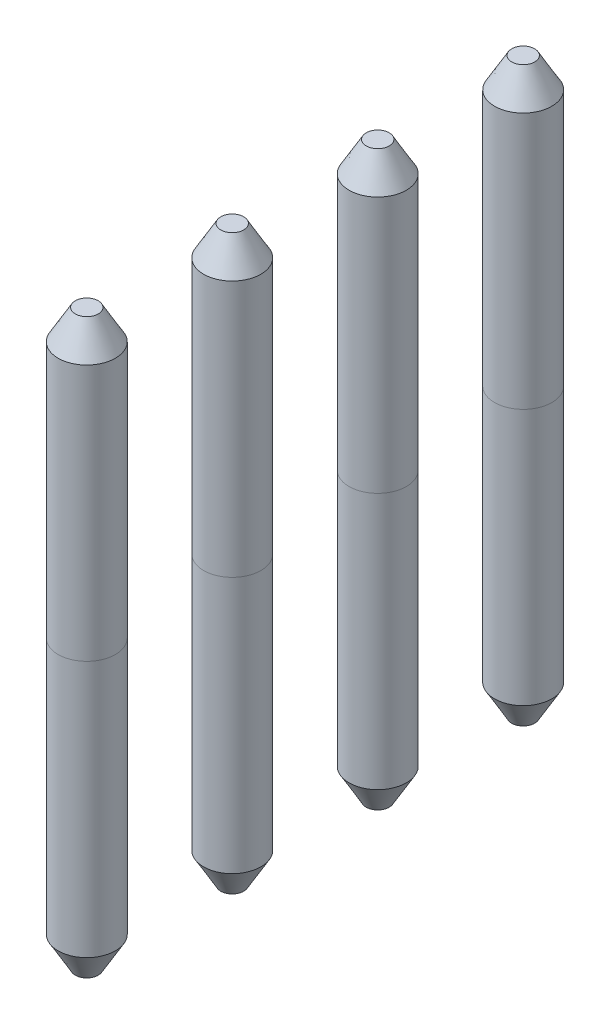
ISO-10303-21;
HEADER;
FILE_DESCRIPTION(('STEP AP214'),'2;1');
FILE_NAME('part.step','',(''),(''),'','','');
FILE_SCHEMA(('AUTOMOTIVE_DESIGN { 1 0 10303 214 1 1 1 1 }'));
ENDSEC;
DATA;
#1=APPLICATION_CONTEXT('core data for automotive mechanical design processes');
#2=APPLICATION_PROTOCOL_DEFINITION('international standard','automotive_design',2000,#1);
#3=PRODUCT_CONTEXT('',#1,'mechanical');
#4=PRODUCT('Part','Part','',(#3));
#5=PRODUCT_RELATED_PRODUCT_CATEGORY('part','',(#4));
#6=PRODUCT_DEFINITION_FORMATION('','',#4);
#7=PRODUCT_DEFINITION_CONTEXT('part definition',#1,'design');
#8=PRODUCT_DEFINITION('design','',#6,#7);
#9=PRODUCT_DEFINITION_SHAPE('','',#8);
#10=(LENGTH_UNIT() NAMED_UNIT(*) SI_UNIT(.MILLI.,.METRE.));
#11=(NAMED_UNIT(*) PLANE_ANGLE_UNIT() SI_UNIT($,.RADIAN.));
#12=(NAMED_UNIT(*) SI_UNIT($,.STERADIAN.) SOLID_ANGLE_UNIT());
#13=UNCERTAINTY_MEASURE_WITH_UNIT(LENGTH_MEASURE(1.E-05),#10,'distance_accuracy_value','');
#14=(GEOMETRIC_REPRESENTATION_CONTEXT(3) GLOBAL_UNCERTAINTY_ASSIGNED_CONTEXT((#13)) GLOBAL_UNIT_ASSIGNED_CONTEXT((#10,
#11,#12)) REPRESENTATION_CONTEXT('',''));
#15=CARTESIAN_POINT('',(0.,0.,0.));
#16=DIRECTION('',(0.,0.,1.));
#17=DIRECTION('',(1.,0.,0.));
#18=AXIS2_PLACEMENT_3D('',#15,#16,#17);
#19=CARTESIAN_POINT('',(0.,0.699186935982855,7.62));
#20=DIRECTION('',(0.,1.,0.));
#21=DIRECTION('',(0.,0.,1.));
#22=AXIS2_PLACEMENT_3D('',#19,#20,#21);
#23=CYLINDRICAL_SURFACE('',#22,0.5);
#24=CARTESIAN_POINT('',(0.,5.17957169371219,7.62));
#25=DIRECTION('',(0.,1.,0.));
#26=DIRECTION('',(0.,0.,1.));
#27=AXIS2_PLACEMENT_3D('',#24,#25,#26);
#28=CIRCLE('',#27,0.5);
#29=CARTESIAN_POINT('',(0.,5.17957169371219,8.12));
#30=VERTEX_POINT('',#29);
#31=EDGE_CURVE('E11',#30,#30,#28,.F.);
#32=ORIENTED_EDGE('',*,*,#31,.T.);
#33=EDGE_LOOP('',(#32));
#34=FACE_BOUND('',#33,.T.);
#35=CARTESIAN_POINT('',(0.,0.699186935982855,7.62));
#36=DIRECTION('',(0.,1.,0.));
#37=DIRECTION('',(0.,0.,1.));
#38=AXIS2_PLACEMENT_3D('',#35,#36,#37);
#39=CIRCLE('',#38,0.5);
#40=CARTESIAN_POINT('',(0.,0.699186935982855,8.12));
#41=VERTEX_POINT('',#40);
#42=EDGE_CURVE('E60',#41,#41,#39,.T.);
#43=ORIENTED_EDGE('',*,*,#42,.T.);
#44=EDGE_LOOP('',(#43));
#45=FACE_BOUND('',#44,.T.);
#46=ADVANCED_FACE('F40',(#34,#45),#23,.T.);
#47=CARTESIAN_POINT('',(0.,0.699186935982855,7.62));
#48=DIRECTION('',(0.,-1.,0.));
#49=DIRECTION('',(0.,0.,-1.));
#50=AXIS2_PLACEMENT_3D('',#47,#48,#49);
#51=CYLINDRICAL_SURFACE('',#50,0.5);
#52=CARTESIAN_POINT('',(0.,-3.78119782174648,7.62));
#53=DIRECTION('',(0.,1.,0.));
#54=DIRECTION('',(0.,0.,1.));
#55=AXIS2_PLACEMENT_3D('',#52,#53,#54);
#56=CIRCLE('',#55,0.5);
#57=CARTESIAN_POINT('',(0.,-3.78119782174648,8.12));
#58=VERTEX_POINT('',#57);
#59=EDGE_CURVE('E55',#58,#58,#56,.T.);
#60=ORIENTED_EDGE('',*,*,#59,.T.);
#61=EDGE_LOOP('',(#60));
#62=FACE_BOUND('',#61,.T.);
#63=ORIENTED_EDGE('',*,*,#42,.F.);
#64=EDGE_LOOP('',(#63));
#65=FACE_BOUND('',#64,.T.);
#66=ADVANCED_FACE('F65',(#62,#65),#51,.T.);
#67=CARTESIAN_POINT('',(0.,5.69918693598285,7.62));
#68=DIRECTION('',(0.,1.,0.));
#69=DIRECTION('',(0.,0.,1.));
#70=AXIS2_PLACEMENT_3D('',#67,#68,#69);
#71=PLANE('',#70);
#72=CARTESIAN_POINT('',(0.,5.69918693598285,7.62));
#73=DIRECTION('',(0.,1.,0.));
#74=DIRECTION('',(0.,0.,1.));
#75=AXIS2_PLACEMENT_3D('',#72,#73,#74);
#76=CIRCLE('',#75,0.199999999999998);
#77=CARTESIAN_POINT('',(0.,5.69918693598285,7.82));
#78=VERTEX_POINT('',#77);
#79=EDGE_CURVE('E47',#78,#78,#76,.T.);
#80=ORIENTED_EDGE('',*,*,#79,.T.);
#81=EDGE_LOOP('',(#80));
#82=FACE_BOUND('',#81,.T.);
#83=ADVANCED_FACE('F67',(#82),#71,.T.);
#84=CARTESIAN_POINT('',(0.,-4.30081306401715,7.62));
#85=DIRECTION('',(0.,1.,0.));
#86=DIRECTION('',(0.,0.,1.));
#87=AXIS2_PLACEMENT_3D('',#84,#85,#86);
#88=PLANE('',#87);
#89=CARTESIAN_POINT('',(0.,-4.30081306401715,7.62));
#90=DIRECTION('',(0.,1.,0.));
#91=DIRECTION('',(0.,0.,1.));
#92=AXIS2_PLACEMENT_3D('',#89,#90,#91);
#93=CIRCLE('',#92,0.2);
#94=CARTESIAN_POINT('',(0.,-4.30081306401715,7.82));
#95=VERTEX_POINT('',#94);
#96=EDGE_CURVE('E51',#95,#95,#93,.F.);
#97=ORIENTED_EDGE('',*,*,#96,.T.);
#98=EDGE_LOOP('',(#97));
#99=FACE_BOUND('',#98,.T.);
#100=ADVANCED_FACE('F74',(#99),#88,.F.);
#101=CARTESIAN_POINT('',(0.,-3.78119782174648,7.62));
#102=DIRECTION('',(0.,1.,0.));
#103=DIRECTION('',(0.,0.,1.));
#104=AXIS2_PLACEMENT_3D('',#101,#102,#103);
#105=CONICAL_SURFACE('',#104,0.5,0.523598775598298);
#106=ORIENTED_EDGE('',*,*,#96,.F.);
#107=EDGE_LOOP('',(#106));
#108=FACE_BOUND('',#107,.T.);
#109=ORIENTED_EDGE('',*,*,#59,.F.);
#110=EDGE_LOOP('',(#109));
#111=FACE_BOUND('',#110,.T.);
#112=ADVANCED_FACE('F78',(#108,#111),#105,.T.);
#113=CARTESIAN_POINT('',(0.,5.69918693598285,7.62));
#114=DIRECTION('',(0.,-1.,0.));
#115=DIRECTION('',(0.,0.,-1.));
#116=AXIS2_PLACEMENT_3D('',#113,#114,#115);
#117=CONICAL_SURFACE('',#116,0.199999999999998,0.523598775598299);
#118=ORIENTED_EDGE('',*,*,#31,.F.);
#119=EDGE_LOOP('',(#118));
#120=FACE_BOUND('',#119,.T.);
#121=ORIENTED_EDGE('',*,*,#79,.F.);
#122=EDGE_LOOP('',(#121));
#123=FACE_BOUND('',#122,.T.);
#124=ADVANCED_FACE('F42',(#120,#123),#117,.T.);
#125=CLOSED_SHELL('',(#46,#66,#83,#100,#112,#124));
#126=MANIFOLD_SOLID_BREP('B2',#125);
#127=CARTESIAN_POINT('',(0.,0.699186935982855,5.08));
#128=DIRECTION('',(0.,1.,0.));
#129=DIRECTION('',(0.,0.,1.));
#130=AXIS2_PLACEMENT_3D('',#127,#128,#129);
#131=CYLINDRICAL_SURFACE('',#130,0.5);
#132=CARTESIAN_POINT('',(0.,5.17957169371219,5.08));
#133=DIRECTION('',(0.,1.,0.));
#134=DIRECTION('',(0.,0.,1.));
#135=AXIS2_PLACEMENT_3D('',#132,#133,#134);
#136=CIRCLE('',#135,0.5);
#137=CARTESIAN_POINT('',(0.,5.17957169371219,5.58));
#138=VERTEX_POINT('',#137);
#139=EDGE_CURVE('E39',#138,#138,#136,.F.);
#140=ORIENTED_EDGE('',*,*,#139,.T.);
#141=EDGE_LOOP('',(#140));
#142=FACE_BOUND('',#141,.T.);
#143=CARTESIAN_POINT('',(0.,0.699186935982855,5.08));
#144=DIRECTION('',(0.,1.,0.));
#145=DIRECTION('',(0.,0.,1.));
#146=AXIS2_PLACEMENT_3D('',#143,#144,#145);
#147=CIRCLE('',#146,0.5);
#148=CARTESIAN_POINT('',(0.,0.699186935982855,5.58));
#149=VERTEX_POINT('',#148);
#150=EDGE_CURVE('E154',#149,#149,#147,.T.);
#151=ORIENTED_EDGE('',*,*,#150,.T.);
#152=EDGE_LOOP('',(#151));
#153=FACE_BOUND('',#152,.T.);
#154=ADVANCED_FACE('F134',(#142,#153),#131,.T.);
#155=CARTESIAN_POINT('',(0.,0.699186935982855,5.08));
#156=DIRECTION('',(0.,-1.,0.));
#157=DIRECTION('',(0.,0.,-1.));
#158=AXIS2_PLACEMENT_3D('',#155,#156,#157);
#159=CYLINDRICAL_SURFACE('',#158,0.5);
#160=CARTESIAN_POINT('',(0.,-3.78119782174648,5.08));
#161=DIRECTION('',(0.,1.,0.));
#162=DIRECTION('',(0.,0.,1.));
#163=AXIS2_PLACEMENT_3D('',#160,#161,#162);
#164=CIRCLE('',#163,0.5);
#165=CARTESIAN_POINT('',(0.,-3.78119782174648,5.58));
#166=VERTEX_POINT('',#165);
#167=EDGE_CURVE('E149',#166,#166,#164,.T.);
#168=ORIENTED_EDGE('',*,*,#167,.T.);
#169=EDGE_LOOP('',(#168));
#170=FACE_BOUND('',#169,.T.);
#171=ORIENTED_EDGE('',*,*,#150,.F.);
#172=EDGE_LOOP('',(#171));
#173=FACE_BOUND('',#172,.T.);
#174=ADVANCED_FACE('F159',(#170,#173),#159,.T.);
#175=CARTESIAN_POINT('',(0.,5.69918693598285,5.08));
#176=DIRECTION('',(0.,1.,0.));
#177=DIRECTION('',(0.,0.,1.));
#178=AXIS2_PLACEMENT_3D('',#175,#176,#177);
#179=PLANE('',#178);
#180=CARTESIAN_POINT('',(0.,5.69918693598285,5.08));
#181=DIRECTION('',(0.,1.,0.));
#182=DIRECTION('',(0.,0.,1.));
#183=AXIS2_PLACEMENT_3D('',#180,#181,#182);
#184=CIRCLE('',#183,0.199999999999998);
#185=CARTESIAN_POINT('',(0.,5.69918693598285,5.28));
#186=VERTEX_POINT('',#185);
#187=EDGE_CURVE('E141',#186,#186,#184,.T.);
#188=ORIENTED_EDGE('',*,*,#187,.T.);
#189=EDGE_LOOP('',(#188));
#190=FACE_BOUND('',#189,.T.);
#191=ADVANCED_FACE('F161',(#190),#179,.T.);
#192=CARTESIAN_POINT('',(0.,-4.30081306401715,5.08));
#193=DIRECTION('',(0.,1.,0.));
#194=DIRECTION('',(0.,0.,1.));
#195=AXIS2_PLACEMENT_3D('',#192,#193,#194);
#196=PLANE('',#195);
#197=CARTESIAN_POINT('',(0.,-4.30081306401715,5.08));
#198=DIRECTION('',(0.,1.,0.));
#199=DIRECTION('',(0.,0.,1.));
#200=AXIS2_PLACEMENT_3D('',#197,#198,#199);
#201=CIRCLE('',#200,0.2);
#202=CARTESIAN_POINT('',(0.,-4.30081306401715,5.28));
#203=VERTEX_POINT('',#202);
#204=EDGE_CURVE('E145',#203,#203,#201,.F.);
#205=ORIENTED_EDGE('',*,*,#204,.T.);
#206=EDGE_LOOP('',(#205));
#207=FACE_BOUND('',#206,.T.);
#208=ADVANCED_FACE('F168',(#207),#196,.F.);
#209=CARTESIAN_POINT('',(0.,-3.78119782174648,5.08));
#210=DIRECTION('',(0.,1.,0.));
#211=DIRECTION('',(0.,0.,1.));
#212=AXIS2_PLACEMENT_3D('',#209,#210,#211);
#213=CONICAL_SURFACE('',#212,0.5,0.523598775598298);
#214=ORIENTED_EDGE('',*,*,#204,.F.);
#215=EDGE_LOOP('',(#214));
#216=FACE_BOUND('',#215,.T.);
#217=ORIENTED_EDGE('',*,*,#167,.F.);
#218=EDGE_LOOP('',(#217));
#219=FACE_BOUND('',#218,.T.);
#220=ADVANCED_FACE('F172',(#216,#219),#213,.T.);
#221=CARTESIAN_POINT('',(0.,5.69918693598285,5.08));
#222=DIRECTION('',(0.,-1.,0.));
#223=DIRECTION('',(0.,0.,-1.));
#224=AXIS2_PLACEMENT_3D('',#221,#222,#223);
#225=CONICAL_SURFACE('',#224,0.199999999999998,0.523598775598299);
#226=ORIENTED_EDGE('',*,*,#139,.F.);
#227=EDGE_LOOP('',(#226));
#228=FACE_BOUND('',#227,.T.);
#229=ORIENTED_EDGE('',*,*,#187,.F.);
#230=EDGE_LOOP('',(#229));
#231=FACE_BOUND('',#230,.T.);
#232=ADVANCED_FACE('F136',(#228,#231),#225,.T.);
#233=CLOSED_SHELL('',(#154,#174,#191,#208,#220,#232));
#234=MANIFOLD_SOLID_BREP('B6',#233);
#235=CARTESIAN_POINT('',(0.,0.699186935982855,2.54));
#236=DIRECTION('',(0.,1.,0.));
#237=DIRECTION('',(0.,0.,1.));
#238=AXIS2_PLACEMENT_3D('',#235,#236,#237);
#239=CYLINDRICAL_SURFACE('',#238,0.5);
#240=CARTESIAN_POINT('',(0.,5.17957169371219,2.54));
#241=DIRECTION('',(0.,1.,0.));
#242=DIRECTION('',(0.,0.,1.));
#243=AXIS2_PLACEMENT_3D('',#240,#241,#242);
#244=CIRCLE('',#243,0.5);
#245=CARTESIAN_POINT('',(0.,5.17957169371219,3.04));
#246=VERTEX_POINT('',#245);
#247=EDGE_CURVE('E133',#246,#246,#244,.F.);
#248=ORIENTED_EDGE('',*,*,#247,.T.);
#249=EDGE_LOOP('',(#248));
#250=FACE_BOUND('',#249,.T.);
#251=CARTESIAN_POINT('',(0.,0.699186935982855,2.54));
#252=DIRECTION('',(0.,1.,0.));
#253=DIRECTION('',(0.,0.,1.));
#254=AXIS2_PLACEMENT_3D('',#251,#252,#253);
#255=CIRCLE('',#254,0.5);
#256=CARTESIAN_POINT('',(0.,0.699186935982855,3.04));
#257=VERTEX_POINT('',#256);
#258=EDGE_CURVE('E247',#257,#257,#255,.T.);
#259=ORIENTED_EDGE('',*,*,#258,.T.);
#260=EDGE_LOOP('',(#259));
#261=FACE_BOUND('',#260,.T.);
#262=ADVANCED_FACE('F227',(#250,#261),#239,.T.);
#263=CARTESIAN_POINT('',(0.,0.699186935982855,2.54));
#264=DIRECTION('',(0.,-1.,0.));
#265=DIRECTION('',(0.,0.,-1.));
#266=AXIS2_PLACEMENT_3D('',#263,#264,#265);
#267=CYLINDRICAL_SURFACE('',#266,0.5);
#268=CARTESIAN_POINT('',(0.,-3.78119782174648,2.54));
#269=DIRECTION('',(0.,1.,0.));
#270=DIRECTION('',(0.,0.,1.));
#271=AXIS2_PLACEMENT_3D('',#268,#269,#270);
#272=CIRCLE('',#271,0.5);
#273=CARTESIAN_POINT('',(0.,-3.78119782174648,3.04));
#274=VERTEX_POINT('',#273);
#275=EDGE_CURVE('E242',#274,#274,#272,.T.);
#276=ORIENTED_EDGE('',*,*,#275,.T.);
#277=EDGE_LOOP('',(#276));
#278=FACE_BOUND('',#277,.T.);
#279=ORIENTED_EDGE('',*,*,#258,.F.);
#280=EDGE_LOOP('',(#279));
#281=FACE_BOUND('',#280,.T.);
#282=ADVANCED_FACE('F252',(#278,#281),#267,.T.);
#283=CARTESIAN_POINT('',(0.,5.69918693598285,2.54));
#284=DIRECTION('',(0.,1.,0.));
#285=DIRECTION('',(0.,0.,1.));
#286=AXIS2_PLACEMENT_3D('',#283,#284,#285);
#287=PLANE('',#286);
#288=CARTESIAN_POINT('',(0.,5.69918693598285,2.54));
#289=DIRECTION('',(0.,1.,0.));
#290=DIRECTION('',(0.,0.,1.));
#291=AXIS2_PLACEMENT_3D('',#288,#289,#290);
#292=CIRCLE('',#291,0.199999999999998);
#293=CARTESIAN_POINT('',(0.,5.69918693598285,2.74));
#294=VERTEX_POINT('',#293);
#295=EDGE_CURVE('E234',#294,#294,#292,.T.);
#296=ORIENTED_EDGE('',*,*,#295,.T.);
#297=EDGE_LOOP('',(#296));
#298=FACE_BOUND('',#297,.T.);
#299=ADVANCED_FACE('F254',(#298),#287,.T.);
#300=CARTESIAN_POINT('',(0.,-4.30081306401715,2.54));
#301=DIRECTION('',(0.,1.,0.));
#302=DIRECTION('',(0.,0.,1.));
#303=AXIS2_PLACEMENT_3D('',#300,#301,#302);
#304=PLANE('',#303);
#305=CARTESIAN_POINT('',(0.,-4.30081306401715,2.54));
#306=DIRECTION('',(0.,1.,0.));
#307=DIRECTION('',(0.,0.,1.));
#308=AXIS2_PLACEMENT_3D('',#305,#306,#307);
#309=CIRCLE('',#308,0.2);
#310=CARTESIAN_POINT('',(0.,-4.30081306401715,2.74));
#311=VERTEX_POINT('',#310);
#312=EDGE_CURVE('E238',#311,#311,#309,.F.);
#313=ORIENTED_EDGE('',*,*,#312,.T.);
#314=EDGE_LOOP('',(#313));
#315=FACE_BOUND('',#314,.T.);
#316=ADVANCED_FACE('F261',(#315),#304,.F.);
#317=CARTESIAN_POINT('',(0.,-3.78119782174648,2.54));
#318=DIRECTION('',(0.,1.,0.));
#319=DIRECTION('',(0.,0.,1.));
#320=AXIS2_PLACEMENT_3D('',#317,#318,#319);
#321=CONICAL_SURFACE('',#320,0.5,0.523598775598298);
#322=ORIENTED_EDGE('',*,*,#312,.F.);
#323=EDGE_LOOP('',(#322));
#324=FACE_BOUND('',#323,.T.);
#325=ORIENTED_EDGE('',*,*,#275,.F.);
#326=EDGE_LOOP('',(#325));
#327=FACE_BOUND('',#326,.T.);
#328=ADVANCED_FACE('F265',(#324,#327),#321,.T.);
#329=CARTESIAN_POINT('',(0.,5.69918693598285,2.54));
#330=DIRECTION('',(0.,-1.,0.));
#331=DIRECTION('',(0.,0.,-1.));
#332=AXIS2_PLACEMENT_3D('',#329,#330,#331);
#333=CONICAL_SURFACE('',#332,0.199999999999998,0.523598775598299);
#334=ORIENTED_EDGE('',*,*,#247,.F.);
#335=EDGE_LOOP('',(#334));
#336=FACE_BOUND('',#335,.T.);
#337=ORIENTED_EDGE('',*,*,#295,.F.);
#338=EDGE_LOOP('',(#337));
#339=FACE_BOUND('',#338,.T.);
#340=ADVANCED_FACE('F229',(#336,#339),#333,.T.);
#341=CLOSED_SHELL('',(#262,#282,#299,#316,#328,#340));
#342=MANIFOLD_SOLID_BREP('B34',#341);
#343=CARTESIAN_POINT('',(0.,0.699186935982855,0.));
#344=DIRECTION('',(0.,1.,0.));
#345=DIRECTION('',(0.,0.,1.));
#346=AXIS2_PLACEMENT_3D('',#343,#344,#345);
#347=CYLINDRICAL_SURFACE('',#346,0.5);
#348=CARTESIAN_POINT('',(0.,5.17957169371219,0.));
#349=DIRECTION('',(0.,1.,0.));
#350=DIRECTION('',(0.,0.,1.));
#351=AXIS2_PLACEMENT_3D('',#348,#349,#350);
#352=CIRCLE('',#351,0.5);
#353=CARTESIAN_POINT('',(0.,5.17957169371219,0.5));
#354=VERTEX_POINT('',#353);
#355=EDGE_CURVE('E226',#354,#354,#352,.F.);
#356=ORIENTED_EDGE('',*,*,#355,.T.);
#357=EDGE_LOOP('',(#356));
#358=FACE_BOUND('',#357,.T.);
#359=CARTESIAN_POINT('',(0.,0.699186935982855,0.));
#360=DIRECTION('',(0.,1.,0.));
#361=DIRECTION('',(0.,0.,1.));
#362=AXIS2_PLACEMENT_3D('',#359,#360,#361);
#363=CIRCLE('',#362,0.5);
#364=CARTESIAN_POINT('',(0.,0.699186935982855,0.5));
#365=VERTEX_POINT('',#364);
#366=EDGE_CURVE('E333',#365,#365,#363,.T.);
#367=ORIENTED_EDGE('',*,*,#366,.T.);
#368=EDGE_LOOP('',(#367));
#369=FACE_BOUND('',#368,.T.);
#370=ADVANCED_FACE('F313',(#358,#369),#347,.T.);
#371=CARTESIAN_POINT('',(0.,0.699186935982855,0.));
#372=DIRECTION('',(0.,-1.,0.));
#373=DIRECTION('',(0.,0.,-1.));
#374=AXIS2_PLACEMENT_3D('',#371,#372,#373);
#375=CYLINDRICAL_SURFACE('',#374,0.5);
#376=CARTESIAN_POINT('',(0.,-3.78119782174648,0.));
#377=DIRECTION('',(0.,1.,0.));
#378=DIRECTION('',(0.,0.,1.));
#379=AXIS2_PLACEMENT_3D('',#376,#377,#378);
#380=CIRCLE('',#379,0.5);
#381=CARTESIAN_POINT('',(0.,-3.78119782174648,0.5));
#382=VERTEX_POINT('',#381);
#383=EDGE_CURVE('E328',#382,#382,#380,.T.);
#384=ORIENTED_EDGE('',*,*,#383,.T.);
#385=EDGE_LOOP('',(#384));
#386=FACE_BOUND('',#385,.T.);
#387=ORIENTED_EDGE('',*,*,#366,.F.);
#388=EDGE_LOOP('',(#387));
#389=FACE_BOUND('',#388,.T.);
#390=ADVANCED_FACE('F338',(#386,#389),#375,.T.);
#391=CARTESIAN_POINT('',(0.,5.69918693598285,0.));
#392=DIRECTION('',(0.,1.,0.));
#393=DIRECTION('',(0.,0.,1.));
#394=AXIS2_PLACEMENT_3D('',#391,#392,#393);
#395=PLANE('',#394);
#396=CARTESIAN_POINT('',(0.,5.69918693598285,0.));
#397=DIRECTION('',(0.,1.,0.));
#398=DIRECTION('',(0.,0.,1.));
#399=AXIS2_PLACEMENT_3D('',#396,#397,#398);
#400=CIRCLE('',#399,0.199999999999998);
#401=CARTESIAN_POINT('',(0.,5.69918693598285,0.199999999999998));
#402=VERTEX_POINT('',#401);
#403=EDGE_CURVE('E320',#402,#402,#400,.T.);
#404=ORIENTED_EDGE('',*,*,#403,.T.);
#405=EDGE_LOOP('',(#404));
#406=FACE_BOUND('',#405,.T.);
#407=ADVANCED_FACE('F340',(#406),#395,.T.);
#408=CARTESIAN_POINT('',(0.,-4.30081306401715,0.));
#409=DIRECTION('',(0.,1.,0.));
#410=DIRECTION('',(0.,0.,1.));
#411=AXIS2_PLACEMENT_3D('',#408,#409,#410);
#412=PLANE('',#411);
#413=CARTESIAN_POINT('',(0.,-4.30081306401715,0.));
#414=DIRECTION('',(0.,1.,0.));
#415=DIRECTION('',(0.,0.,1.));
#416=AXIS2_PLACEMENT_3D('',#413,#414,#415);
#417=CIRCLE('',#416,0.2);
#418=CARTESIAN_POINT('',(0.,-4.30081306401715,0.2));
#419=VERTEX_POINT('',#418);
#420=EDGE_CURVE('E324',#419,#419,#417,.F.);
#421=ORIENTED_EDGE('',*,*,#420,.T.);
#422=EDGE_LOOP('',(#421));
#423=FACE_BOUND('',#422,.T.);
#424=ADVANCED_FACE('F347',(#423),#412,.F.);
#425=CARTESIAN_POINT('',(0.,-3.78119782174648,0.));
#426=DIRECTION('',(0.,1.,0.));
#427=DIRECTION('',(0.,0.,1.));
#428=AXIS2_PLACEMENT_3D('',#425,#426,#427);
#429=CONICAL_SURFACE('',#428,0.5,0.523598775598298);
#430=ORIENTED_EDGE('',*,*,#420,.F.);
#431=EDGE_LOOP('',(#430));
#432=FACE_BOUND('',#431,.T.);
#433=ORIENTED_EDGE('',*,*,#383,.F.);
#434=EDGE_LOOP('',(#433));
#435=FACE_BOUND('',#434,.T.);
#436=ADVANCED_FACE('F351',(#432,#435),#429,.T.);
#437=CARTESIAN_POINT('',(0.,5.69918693598285,0.));
#438=DIRECTION('',(0.,-1.,0.));
#439=DIRECTION('',(0.,0.,-1.));
#440=AXIS2_PLACEMENT_3D('',#437,#438,#439);
#441=CONICAL_SURFACE('',#440,0.199999999999998,0.523598775598299);
#442=ORIENTED_EDGE('',*,*,#355,.F.);
#443=EDGE_LOOP('',(#442));
#444=FACE_BOUND('',#443,.T.);
#445=ORIENTED_EDGE('',*,*,#403,.F.);
#446=EDGE_LOOP('',(#445));
#447=FACE_BOUND('',#446,.T.);
#448=ADVANCED_FACE('F315',(#444,#447),#441,.T.);
#449=CLOSED_SHELL('',(#370,#390,#407,#424,#436,#448));
#450=MANIFOLD_SOLID_BREP('B128',#449);
#451=ADVANCED_BREP_SHAPE_REPRESENTATION('',(#18,#126,#234,#342,#450),#14);
#452=SHAPE_DEFINITION_REPRESENTATION(#9,#451);
ENDSEC;
END-ISO-10303-21;
